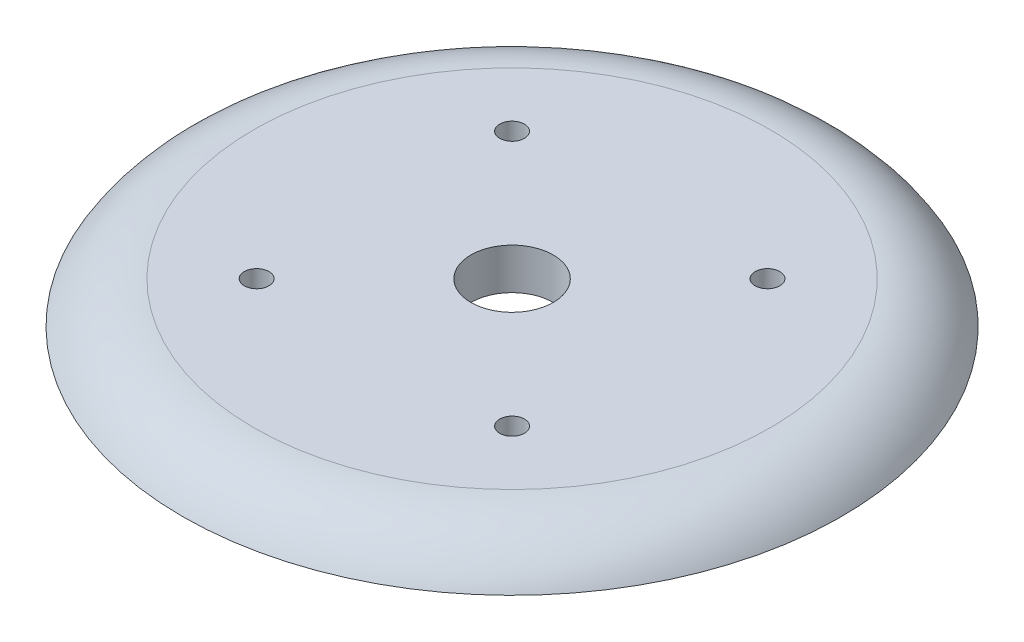
ISO-10303-21;
HEADER;
FILE_DESCRIPTION(('STEP AP214'),'2;1');
FILE_NAME('part.step','',(''),(''),'','','');
FILE_SCHEMA(('AUTOMOTIVE_DESIGN { 1 0 10303 214 1 1 1 1 }'));
ENDSEC;
DATA;
#1=APPLICATION_CONTEXT('core data for automotive mechanical design processes');
#2=APPLICATION_PROTOCOL_DEFINITION('international standard','automotive_design',2000,#1);
#3=PRODUCT_CONTEXT('',#1,'mechanical');
#4=PRODUCT('Part','Part','',(#3));
#5=PRODUCT_RELATED_PRODUCT_CATEGORY('part','',(#4));
#6=PRODUCT_DEFINITION_FORMATION('','',#4);
#7=PRODUCT_DEFINITION_CONTEXT('part definition',#1,'design');
#8=PRODUCT_DEFINITION('design','',#6,#7);
#9=PRODUCT_DEFINITION_SHAPE('','',#8);
#10=(LENGTH_UNIT() NAMED_UNIT(*) SI_UNIT(.MILLI.,.METRE.));
#11=(NAMED_UNIT(*) PLANE_ANGLE_UNIT() SI_UNIT($,.RADIAN.));
#12=(NAMED_UNIT(*) SI_UNIT($,.STERADIAN.) SOLID_ANGLE_UNIT());
#13=UNCERTAINTY_MEASURE_WITH_UNIT(LENGTH_MEASURE(1.E-05),#10,'distance_accuracy_value','');
#14=(GEOMETRIC_REPRESENTATION_CONTEXT(3) GLOBAL_UNCERTAINTY_ASSIGNED_CONTEXT((#13)) GLOBAL_UNIT_ASSIGNED_CONTEXT((#10,
#11,#12)) REPRESENTATION_CONTEXT('',''));
#15=CARTESIAN_POINT('',(0.,0.,0.));
#16=DIRECTION('',(0.,0.,1.));
#17=DIRECTION('',(1.,0.,0.));
#18=AXIS2_PLACEMENT_3D('',#15,#16,#17);
#19=CARTESIAN_POINT('',(-15.5,5.,-15.5));
#20=DIRECTION('',(0.,-1.,0.));
#21=DIRECTION('',(0.,0.,-1.));
#22=AXIS2_PLACEMENT_3D('',#19,#20,#21);
#23=CYLINDRICAL_SURFACE('',#22,1.5);
#24=CARTESIAN_POINT('',(-15.5,5.,-15.5));
#25=DIRECTION('',(0.,1.,0.));
#26=DIRECTION('',(0.,0.,1.));
#27=AXIS2_PLACEMENT_3D('',#24,#25,#26);
#28=CIRCLE('',#27,1.5);
#29=CARTESIAN_POINT('',(-15.5,5.,-14.));
#30=VERTEX_POINT('',#29);
#31=EDGE_CURVE('E44',#30,#30,#28,.T.);
#32=ORIENTED_EDGE('',*,*,#31,.T.);
#33=EDGE_LOOP('',(#32));
#34=FACE_BOUND('',#33,.T.);
#35=CARTESIAN_POINT('',(-15.5,0.,-15.5));
#36=DIRECTION('',(0.,1.,0.));
#37=DIRECTION('',(0.,0.,1.));
#38=AXIS2_PLACEMENT_3D('',#35,#36,#37);
#39=CIRCLE('',#38,1.5);
#40=CARTESIAN_POINT('',(-15.5,0.,-14.));
#41=VERTEX_POINT('',#40);
#42=EDGE_CURVE('E62',#41,#41,#39,.T.);
#43=ORIENTED_EDGE('',*,*,#42,.F.);
#44=EDGE_LOOP('',(#43));
#45=FACE_BOUND('',#44,.T.);
#46=ADVANCED_FACE('F33',(#34,#45),#23,.F.);
#47=CARTESIAN_POINT('',(15.5,5.,-15.5));
#48=DIRECTION('',(0.,-1.,0.));
#49=DIRECTION('',(0.,0.,-1.));
#50=AXIS2_PLACEMENT_3D('',#47,#48,#49);
#51=CYLINDRICAL_SURFACE('',#50,1.5);
#52=CARTESIAN_POINT('',(15.5,5.,-15.5));
#53=DIRECTION('',(0.,1.,0.));
#54=DIRECTION('',(0.,0.,1.));
#55=AXIS2_PLACEMENT_3D('',#52,#53,#54);
#56=CIRCLE('',#55,1.5);
#57=CARTESIAN_POINT('',(15.5,5.,-14.));
#58=VERTEX_POINT('',#57);
#59=EDGE_CURVE('E49',#58,#58,#56,.T.);
#60=ORIENTED_EDGE('',*,*,#59,.T.);
#61=EDGE_LOOP('',(#60));
#62=FACE_BOUND('',#61,.T.);
#63=CARTESIAN_POINT('',(15.5,0.,-15.5));
#64=DIRECTION('',(0.,1.,0.));
#65=DIRECTION('',(0.,0.,1.));
#66=AXIS2_PLACEMENT_3D('',#63,#64,#65);
#67=CIRCLE('',#66,1.5);
#68=CARTESIAN_POINT('',(15.5,0.,-14.));
#69=VERTEX_POINT('',#68);
#70=EDGE_CURVE('E59',#69,#69,#67,.T.);
#71=ORIENTED_EDGE('',*,*,#70,.F.);
#72=EDGE_LOOP('',(#71));
#73=FACE_BOUND('',#72,.T.);
#74=ADVANCED_FACE('F82',(#62,#73),#51,.F.);
#75=CARTESIAN_POINT('',(-15.5,5.,15.5));
#76=DIRECTION('',(0.,-1.,0.));
#77=DIRECTION('',(0.,0.,-1.));
#78=AXIS2_PLACEMENT_3D('',#75,#76,#77);
#79=CYLINDRICAL_SURFACE('',#78,1.5);
#80=CARTESIAN_POINT('',(-15.5,5.,15.5));
#81=DIRECTION('',(0.,1.,0.));
#82=DIRECTION('',(0.,0.,1.));
#83=AXIS2_PLACEMENT_3D('',#80,#81,#82);
#84=CIRCLE('',#83,1.5);
#85=CARTESIAN_POINT('',(-15.5,5.,17.));
#86=VERTEX_POINT('',#85);
#87=EDGE_CURVE('E73',#86,#86,#84,.T.);
#88=ORIENTED_EDGE('',*,*,#87,.T.);
#89=EDGE_LOOP('',(#88));
#90=FACE_BOUND('',#89,.T.);
#91=CARTESIAN_POINT('',(-15.5,0.,15.5));
#92=DIRECTION('',(0.,1.,0.));
#93=DIRECTION('',(0.,0.,1.));
#94=AXIS2_PLACEMENT_3D('',#91,#92,#93);
#95=CIRCLE('',#94,1.5);
#96=CARTESIAN_POINT('',(-15.5,0.,17.));
#97=VERTEX_POINT('',#96);
#98=EDGE_CURVE('E56',#97,#97,#95,.T.);
#99=ORIENTED_EDGE('',*,*,#98,.F.);
#100=EDGE_LOOP('',(#99));
#101=FACE_BOUND('',#100,.T.);
#102=ADVANCED_FACE('F130',(#90,#101),#79,.F.);
#103=CARTESIAN_POINT('',(15.5,5.,15.5));
#104=DIRECTION('',(0.,-1.,0.));
#105=DIRECTION('',(0.,0.,-1.));
#106=AXIS2_PLACEMENT_3D('',#103,#104,#105);
#107=CYLINDRICAL_SURFACE('',#106,1.5);
#108=CARTESIAN_POINT('',(15.5,5.,15.5));
#109=DIRECTION('',(0.,1.,0.));
#110=DIRECTION('',(0.,0.,1.));
#111=AXIS2_PLACEMENT_3D('',#108,#109,#110);
#112=CIRCLE('',#111,1.5);
#113=CARTESIAN_POINT('',(15.5,5.,17.));
#114=VERTEX_POINT('',#113);
#115=EDGE_CURVE('E69',#114,#114,#112,.T.);
#116=ORIENTED_EDGE('',*,*,#115,.T.);
#117=EDGE_LOOP('',(#116));
#118=FACE_BOUND('',#117,.T.);
#119=CARTESIAN_POINT('',(15.5,0.,15.5));
#120=DIRECTION('',(0.,1.,0.));
#121=DIRECTION('',(0.,0.,1.));
#122=AXIS2_PLACEMENT_3D('',#119,#120,#121);
#123=CIRCLE('',#122,1.5);
#124=CARTESIAN_POINT('',(15.5,0.,17.));
#125=VERTEX_POINT('',#124);
#126=EDGE_CURVE('E53',#125,#125,#123,.T.);
#127=ORIENTED_EDGE('',*,*,#126,.F.);
#128=EDGE_LOOP('',(#127));
#129=FACE_BOUND('',#128,.T.);
#130=ADVANCED_FACE('F123',(#118,#129),#107,.F.);
#131=CARTESIAN_POINT('',(0.,5.,0.));
#132=DIRECTION('',(0.,-1.,0.));
#133=DIRECTION('',(0.,0.,-1.));
#134=AXIS2_PLACEMENT_3D('',#131,#132,#133);
#135=CYLINDRICAL_SURFACE('',#134,5.);
#136=CARTESIAN_POINT('',(0.,5.,0.));
#137=DIRECTION('',(0.,1.,0.));
#138=DIRECTION('',(0.,0.,1.));
#139=AXIS2_PLACEMENT_3D('',#136,#137,#138);
#140=CIRCLE('',#139,5.);
#141=CARTESIAN_POINT('',(0.,5.,5.));
#142=VERTEX_POINT('',#141);
#143=EDGE_CURVE('E40',#142,#142,#140,.T.);
#144=ORIENTED_EDGE('',*,*,#143,.T.);
#145=EDGE_LOOP('',(#144));
#146=FACE_BOUND('',#145,.T.);
#147=CARTESIAN_POINT('',(0.,0.,0.));
#148=DIRECTION('',(0.,1.,0.));
#149=DIRECTION('',(0.,0.,1.));
#150=AXIS2_PLACEMENT_3D('',#147,#148,#149);
#151=CIRCLE('',#150,5.);
#152=CARTESIAN_POINT('',(0.,0.,5.));
#153=VERTEX_POINT('',#152);
#154=EDGE_CURVE('E67',#153,#153,#151,.T.);
#155=ORIENTED_EDGE('',*,*,#154,.F.);
#156=EDGE_LOOP('',(#155));
#157=FACE_BOUND('',#156,.T.);
#158=ADVANCED_FACE('F89',(#146,#157),#135,.F.);
#159=CARTESIAN_POINT('',(0.,5.,0.));
#160=DIRECTION('',(0.,1.,0.));
#161=DIRECTION('',(0.,0.,1.));
#162=AXIS2_PLACEMENT_3D('',#159,#160,#161);
#163=PLANE('',#162);
#164=CARTESIAN_POINT('',(0.,5.,0.));
#165=DIRECTION('',(0.,1.,0.));
#166=DIRECTION('',(0.,0.,1.));
#167=AXIS2_PLACEMENT_3D('',#164,#165,#166);
#168=CIRCLE('',#167,31.3397459621556);
#169=CARTESIAN_POINT('',(0.,5.,31.3397459621556));
#170=VERTEX_POINT('',#169);
#171=EDGE_CURVE('E10',#170,#170,#168,.T.);
#172=ORIENTED_EDGE('',*,*,#171,.T.);
#173=EDGE_LOOP('',(#172));
#174=FACE_BOUND('',#173,.T.);
#175=ORIENTED_EDGE('',*,*,#115,.F.);
#176=EDGE_LOOP('',(#175));
#177=FACE_BOUND('',#176,.T.);
#178=ORIENTED_EDGE('',*,*,#87,.F.);
#179=EDGE_LOOP('',(#178));
#180=FACE_BOUND('',#179,.T.);
#181=ORIENTED_EDGE('',*,*,#59,.F.);
#182=EDGE_LOOP('',(#181));
#183=FACE_BOUND('',#182,.T.);
#184=ORIENTED_EDGE('',*,*,#31,.F.);
#185=EDGE_LOOP('',(#184));
#186=FACE_BOUND('',#185,.T.);
#187=ORIENTED_EDGE('',*,*,#143,.F.);
#188=EDGE_LOOP('',(#187));
#189=FACE_BOUND('',#188,.T.);
#190=ADVANCED_FACE('F85',(#174,#177,#180,#183,#186,#189),#163,.T.);
#191=CARTESIAN_POINT('',(0.,0.,0.));
#192=DIRECTION('',(0.,1.,0.));
#193=DIRECTION('',(0.,0.,1.));
#194=AXIS2_PLACEMENT_3D('',#191,#192,#193);
#195=PLANE('',#194);
#196=ORIENTED_EDGE('',*,*,#126,.T.);
#197=EDGE_LOOP('',(#196));
#198=FACE_BOUND('',#197,.T.);
#199=ORIENTED_EDGE('',*,*,#98,.T.);
#200=EDGE_LOOP('',(#199));
#201=FACE_BOUND('',#200,.T.);
#202=ORIENTED_EDGE('',*,*,#70,.T.);
#203=EDGE_LOOP('',(#202));
#204=FACE_BOUND('',#203,.T.);
#205=ORIENTED_EDGE('',*,*,#42,.T.);
#206=EDGE_LOOP('',(#205));
#207=FACE_BOUND('',#206,.T.);
#208=CARTESIAN_POINT('',(0.,0.,0.));
#209=DIRECTION('',(0.,1.,0.));
#210=DIRECTION('',(0.,0.,1.));
#211=AXIS2_PLACEMENT_3D('',#208,#209,#210);
#212=CIRCLE('',#211,40.);
#213=CARTESIAN_POINT('',(0.,0.,40.));
#214=VERTEX_POINT('',#213);
#215=EDGE_CURVE('E65',#214,#214,#212,.T.);
#216=ORIENTED_EDGE('',*,*,#215,.F.);
#217=EDGE_LOOP('',(#216));
#218=FACE_BOUND('',#217,.T.);
#219=ORIENTED_EDGE('',*,*,#154,.T.);
#220=EDGE_LOOP('',(#219));
#221=FACE_BOUND('',#220,.T.);
#222=ADVANCED_FACE('F88',(#198,#201,#204,#207,#218,#221),#195,.F.);
#223=CARTESIAN_POINT('',(0.,-5.,0.));
#224=DIRECTION('',(0.,-1.,0.));
#225=DIRECTION('',(0.,0.,-1.));
#226=AXIS2_PLACEMENT_3D('',#223,#224,#225);
#227=TOROIDAL_SURFACE('',#226,31.3397459621556,10.);
#228=ORIENTED_EDGE('',*,*,#215,.T.);
#229=EDGE_LOOP('',(#228));
#230=FACE_BOUND('',#229,.T.);
#231=ORIENTED_EDGE('',*,*,#171,.F.);
#232=EDGE_LOOP('',(#231));
#233=FACE_BOUND('',#232,.T.);
#234=ADVANCED_FACE('F35',(#230,#233),#227,.T.);
#235=CLOSED_SHELL('',(#46,#74,#102,#130,#158,#190,#222,#234));
#236=MANIFOLD_SOLID_BREP('B2',#235);
#237=ADVANCED_BREP_SHAPE_REPRESENTATION('',(#18,#236),#14);
#238=SHAPE_DEFINITION_REPRESENTATION(#9,#237);
ENDSEC;
END-ISO-10303-21;
